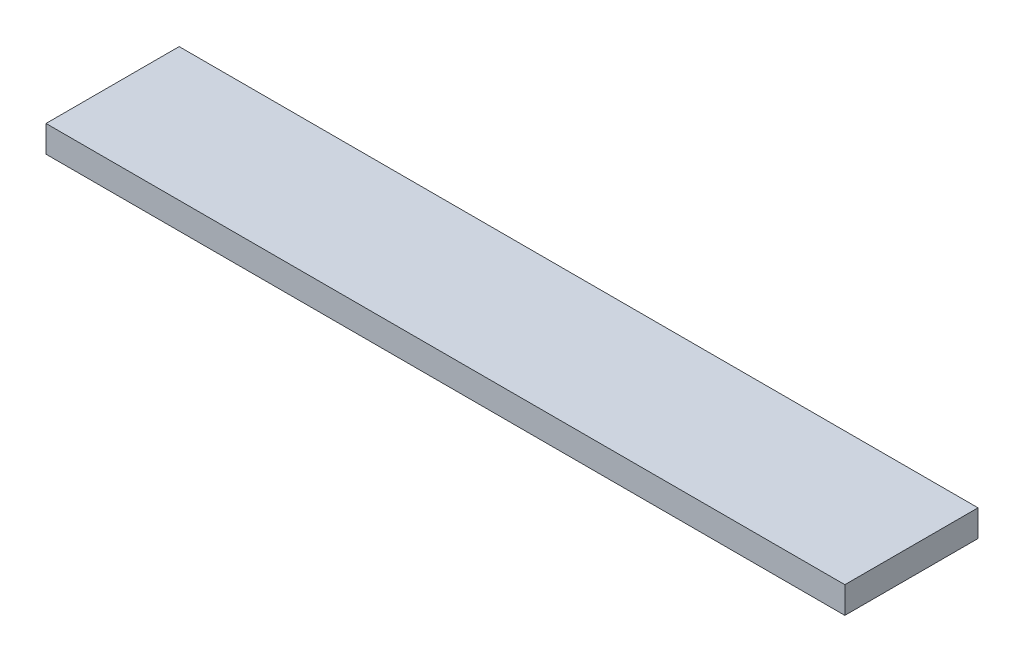
ISO-10303-21;
HEADER;
FILE_DESCRIPTION(('STEP AP214'),'2;1');
FILE_NAME('part.step','',(''),(''),'','','');
FILE_SCHEMA(('AUTOMOTIVE_DESIGN { 1 0 10303 214 1 1 1 1 }'));
ENDSEC;
DATA;
#1=APPLICATION_CONTEXT('core data for automotive mechanical design processes');
#2=APPLICATION_PROTOCOL_DEFINITION('international standard','automotive_design',2000,#1);
#3=PRODUCT_CONTEXT('',#1,'mechanical');
#4=PRODUCT('Part','Part','',(#3));
#5=PRODUCT_RELATED_PRODUCT_CATEGORY('part','',(#4));
#6=PRODUCT_DEFINITION_FORMATION('','',#4);
#7=PRODUCT_DEFINITION_CONTEXT('part definition',#1,'design');
#8=PRODUCT_DEFINITION('design','',#6,#7);
#9=PRODUCT_DEFINITION_SHAPE('','',#8);
#10=(LENGTH_UNIT() NAMED_UNIT(*) SI_UNIT(.MILLI.,.METRE.));
#11=(NAMED_UNIT(*) PLANE_ANGLE_UNIT() SI_UNIT($,.RADIAN.));
#12=(NAMED_UNIT(*) SI_UNIT($,.STERADIAN.) SOLID_ANGLE_UNIT());
#13=UNCERTAINTY_MEASURE_WITH_UNIT(LENGTH_MEASURE(1.E-05),#10,'distance_accuracy_value','');
#14=(GEOMETRIC_REPRESENTATION_CONTEXT(3) GLOBAL_UNCERTAINTY_ASSIGNED_CONTEXT((#13)) GLOBAL_UNIT_ASSIGNED_CONTEXT((#10,
#11,#12)) REPRESENTATION_CONTEXT('',''));
#15=CARTESIAN_POINT('',(0.,0.,0.));
#16=DIRECTION('',(0.,0.,1.));
#17=DIRECTION('',(1.,0.,0.));
#18=AXIS2_PLACEMENT_3D('',#15,#16,#17);
#19=CARTESIAN_POINT('',(-150.,10.,-25.));
#20=DIRECTION('',(1.,0.,0.));
#21=DIRECTION('',(0.,0.,-1.));
#22=AXIS2_PLACEMENT_3D('',#19,#20,#21);
#23=PLANE('',#22);
#24=DIRECTION('',(0.,0.,1.));
#25=VECTOR('',#24,1.);
#26=CARTESIAN_POINT('',(-150.,0.,-25.));
#27=LINE('',#26,#25);
#28=CARTESIAN_POINT('',(-150.,0.,-25.));
#29=VERTEX_POINT('',#28);
#30=CARTESIAN_POINT('',(-150.,0.,25.));
#31=VERTEX_POINT('',#30);
#32=EDGE_CURVE('E96',#29,#31,#27,.T.);
#33=ORIENTED_EDGE('',*,*,#32,.T.);
#34=DIRECTION('',(0.,-1.,0.));
#35=VECTOR('',#34,1.);
#36=CARTESIAN_POINT('',(-150.,10.,25.));
#37=LINE('',#36,#35);
#38=CARTESIAN_POINT('',(-150.,10.,25.));
#39=VERTEX_POINT('',#38);
#40=EDGE_CURVE('E11',#39,#31,#37,.T.);
#41=ORIENTED_EDGE('',*,*,#40,.F.);
#42=DIRECTION('',(0.,0.,1.));
#43=VECTOR('',#42,1.);
#44=CARTESIAN_POINT('',(-150.,10.,-25.));
#45=LINE('',#44,#43);
#46=CARTESIAN_POINT('',(-150.,10.,-25.));
#47=VERTEX_POINT('',#46);
#48=EDGE_CURVE('E84',#47,#39,#45,.T.);
#49=ORIENTED_EDGE('',*,*,#48,.F.);
#50=DIRECTION('',(0.,-1.,0.));
#51=VECTOR('',#50,1.);
#52=CARTESIAN_POINT('',(-150.,10.,-25.));
#53=LINE('',#52,#51);
#54=EDGE_CURVE('E92',#47,#29,#53,.T.);
#55=ORIENTED_EDGE('',*,*,#54,.T.);
#56=EDGE_LOOP('',(#33,#41,#49,#55));
#57=FACE_BOUND('',#56,.T.);
#58=ADVANCED_FACE('F33',(#57),#23,.F.);
#59=CARTESIAN_POINT('',(-150.,10.,25.));
#60=DIRECTION('',(0.,0.,-1.));
#61=DIRECTION('',(-1.,0.,0.));
#62=AXIS2_PLACEMENT_3D('',#59,#60,#61);
#63=PLANE('',#62);
#64=DIRECTION('',(1.,0.,0.));
#65=VECTOR('',#64,1.);
#66=CARTESIAN_POINT('',(-150.,0.,25.));
#67=LINE('',#66,#65);
#68=CARTESIAN_POINT('',(150.,0.,25.));
#69=VERTEX_POINT('',#68);
#70=EDGE_CURVE('E88',#31,#69,#67,.T.);
#71=ORIENTED_EDGE('',*,*,#70,.T.);
#72=DIRECTION('',(0.,-1.,0.));
#73=VECTOR('',#72,1.);
#74=CARTESIAN_POINT('',(150.,10.,25.));
#75=LINE('',#74,#73);
#76=CARTESIAN_POINT('',(150.,10.,25.));
#77=VERTEX_POINT('',#76);
#78=EDGE_CURVE('E41',#77,#69,#75,.T.);
#79=ORIENTED_EDGE('',*,*,#78,.F.);
#80=DIRECTION('',(1.,0.,0.));
#81=VECTOR('',#80,1.);
#82=CARTESIAN_POINT('',(-150.,10.,25.));
#83=LINE('',#82,#81);
#84=EDGE_CURVE('E79',#39,#77,#83,.T.);
#85=ORIENTED_EDGE('',*,*,#84,.F.);
#86=ORIENTED_EDGE('',*,*,#40,.T.);
#87=EDGE_LOOP('',(#71,#79,#85,#86));
#88=FACE_BOUND('',#87,.T.);
#89=ADVANCED_FACE('F87',(#88),#63,.F.);
#90=CARTESIAN_POINT('',(150.,10.,-25.));
#91=DIRECTION('',(-1.,0.,0.));
#92=DIRECTION('',(0.,0.,1.));
#93=AXIS2_PLACEMENT_3D('',#90,#91,#92);
#94=PLANE('',#93);
#95=DIRECTION('',(0.,0.,-1.));
#96=VECTOR('',#95,1.);
#97=CARTESIAN_POINT('',(150.,0.,-25.));
#98=LINE('',#97,#96);
#99=CARTESIAN_POINT('',(150.,0.,-25.));
#100=VERTEX_POINT('',#99);
#101=EDGE_CURVE('E66',#69,#100,#98,.T.);
#102=ORIENTED_EDGE('',*,*,#101,.T.);
#103=DIRECTION('',(0.,-1.,0.));
#104=VECTOR('',#103,1.);
#105=CARTESIAN_POINT('',(150.,10.,-25.));
#106=LINE('',#105,#104);
#107=CARTESIAN_POINT('',(150.,10.,-25.));
#108=VERTEX_POINT('',#107);
#109=EDGE_CURVE('E89',#108,#100,#106,.T.);
#110=ORIENTED_EDGE('',*,*,#109,.F.);
#111=DIRECTION('',(0.,0.,-1.));
#112=VECTOR('',#111,1.);
#113=CARTESIAN_POINT('',(150.,10.,-25.));
#114=LINE('',#113,#112);
#115=EDGE_CURVE('E82',#77,#108,#114,.T.);
#116=ORIENTED_EDGE('',*,*,#115,.F.);
#117=ORIENTED_EDGE('',*,*,#78,.T.);
#118=EDGE_LOOP('',(#102,#110,#116,#117));
#119=FACE_BOUND('',#118,.T.);
#120=ADVANCED_FACE('F90',(#119),#94,.F.);
#121=CARTESIAN_POINT('',(-150.,10.,-25.));
#122=DIRECTION('',(0.,0.,1.));
#123=DIRECTION('',(1.,0.,0.));
#124=AXIS2_PLACEMENT_3D('',#121,#122,#123);
#125=PLANE('',#124);
#126=DIRECTION('',(-1.,0.,0.));
#127=VECTOR('',#126,1.);
#128=CARTESIAN_POINT('',(-150.,0.,-25.));
#129=LINE('',#128,#127);
#130=EDGE_CURVE('E72',#100,#29,#129,.T.);
#131=ORIENTED_EDGE('',*,*,#130,.T.);
#132=ORIENTED_EDGE('',*,*,#54,.F.);
#133=DIRECTION('',(-1.,0.,0.));
#134=VECTOR('',#133,1.);
#135=CARTESIAN_POINT('',(-150.,10.,-25.));
#136=LINE('',#135,#134);
#137=EDGE_CURVE('E49',#108,#47,#136,.T.);
#138=ORIENTED_EDGE('',*,*,#137,.F.);
#139=ORIENTED_EDGE('',*,*,#109,.T.);
#140=EDGE_LOOP('',(#131,#132,#138,#139));
#141=FACE_BOUND('',#140,.T.);
#142=ADVANCED_FACE('F103',(#141),#125,.F.);
#143=CARTESIAN_POINT('',(0.,10.,0.));
#144=DIRECTION('',(0.,1.,0.));
#145=DIRECTION('',(0.,0.,1.));
#146=AXIS2_PLACEMENT_3D('',#143,#144,#145);
#147=PLANE('',#146);
#148=ORIENTED_EDGE('',*,*,#48,.T.);
#149=ORIENTED_EDGE('',*,*,#84,.T.);
#150=ORIENTED_EDGE('',*,*,#115,.T.);
#151=ORIENTED_EDGE('',*,*,#137,.T.);
#152=EDGE_LOOP('',(#148,#149,#150,#151));
#153=FACE_BOUND('',#152,.T.);
#154=ADVANCED_FACE('F80',(#153),#147,.T.);
#155=CARTESIAN_POINT('',(0.,0.,0.));
#156=DIRECTION('',(0.,1.,0.));
#157=DIRECTION('',(0.,0.,1.));
#158=AXIS2_PLACEMENT_3D('',#155,#156,#157);
#159=PLANE('',#158);
#160=ORIENTED_EDGE('',*,*,#32,.F.);
#161=ORIENTED_EDGE('',*,*,#130,.F.);
#162=ORIENTED_EDGE('',*,*,#101,.F.);
#163=ORIENTED_EDGE('',*,*,#70,.F.);
#164=EDGE_LOOP('',(#160,#161,#162,#163));
#165=FACE_BOUND('',#164,.T.);
#166=ADVANCED_FACE('F106',(#165),#159,.F.);
#167=CLOSED_SHELL('',(#58,#89,#120,#142,#154,#166));
#168=MANIFOLD_SOLID_BREP('B2',#167);
#169=ADVANCED_BREP_SHAPE_REPRESENTATION('',(#18,#168),#14);
#170=SHAPE_DEFINITION_REPRESENTATION(#9,#169);
ENDSEC;
END-ISO-10303-21;
